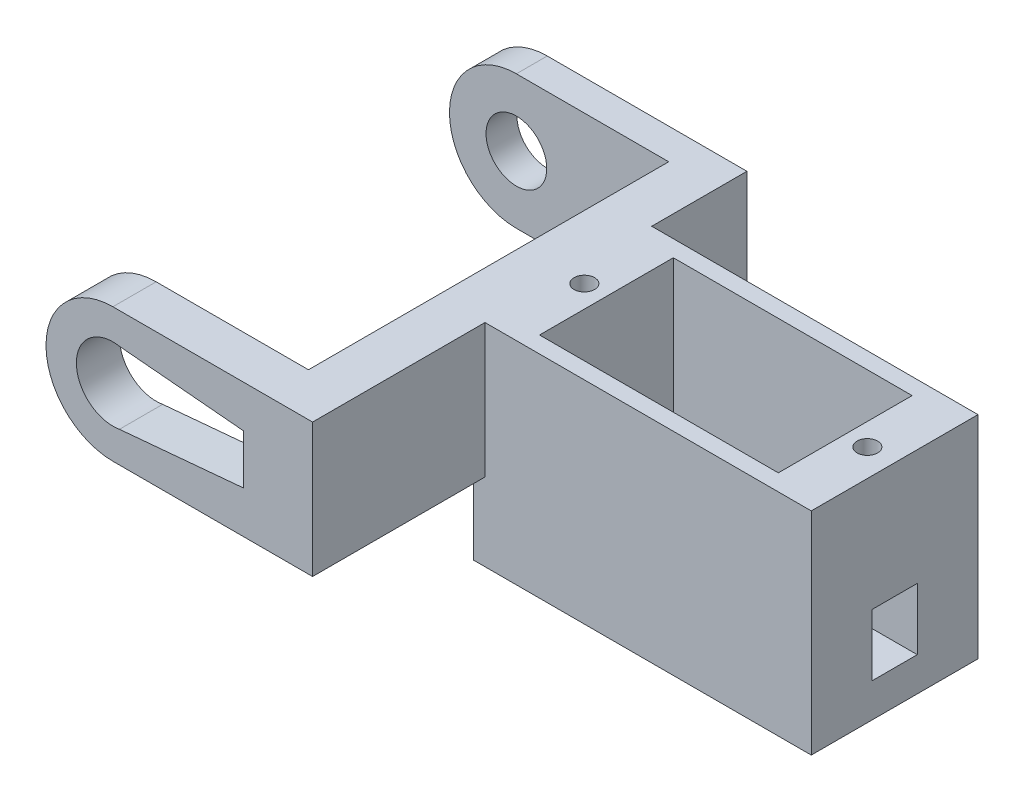
ISO-10303-21;
HEADER;
FILE_DESCRIPTION(('STEP AP214'),'2;1');
FILE_NAME('part.step','',(''),(''),'','','');
FILE_SCHEMA(('AUTOMOTIVE_DESIGN { 1 0 10303 214 1 1 1 1 }'));
ENDSEC;
DATA;
#1=APPLICATION_CONTEXT('core data for automotive mechanical design processes');
#2=APPLICATION_PROTOCOL_DEFINITION('international standard','automotive_design',2000,#1);
#3=PRODUCT_CONTEXT('',#1,'mechanical');
#4=PRODUCT('Part','Part','',(#3));
#5=PRODUCT_RELATED_PRODUCT_CATEGORY('part','',(#4));
#6=PRODUCT_DEFINITION_FORMATION('','',#4);
#7=PRODUCT_DEFINITION_CONTEXT('part definition',#1,'design');
#8=PRODUCT_DEFINITION('design','',#6,#7);
#9=PRODUCT_DEFINITION_SHAPE('','',#8);
#10=(LENGTH_UNIT() NAMED_UNIT(*) SI_UNIT(.MILLI.,.METRE.));
#11=(NAMED_UNIT(*) PLANE_ANGLE_UNIT() SI_UNIT($,.RADIAN.));
#12=(NAMED_UNIT(*) SI_UNIT($,.STERADIAN.) SOLID_ANGLE_UNIT());
#13=UNCERTAINTY_MEASURE_WITH_UNIT(LENGTH_MEASURE(1.E-05),#10,'distance_accuracy_value','');
#14=(GEOMETRIC_REPRESENTATION_CONTEXT(3) GLOBAL_UNCERTAINTY_ASSIGNED_CONTEXT((#13)) GLOBAL_UNIT_ASSIGNED_CONTEXT((#10,
#11,#12)) REPRESENTATION_CONTEXT('',''));
#15=CARTESIAN_POINT('',(0.,0.,0.));
#16=DIRECTION('',(0.,0.,1.));
#17=DIRECTION('',(1.,0.,0.));
#18=AXIS2_PLACEMENT_3D('',#15,#16,#17);
#19=CARTESIAN_POINT('',(-44.6,0.,0.));
#20=DIRECTION('',(-1.,0.,0.));
#21=DIRECTION('',(0.,0.,1.));
#22=AXIS2_PLACEMENT_3D('',#19,#20,#21);
#23=PLANE('',#22);
#24=DIRECTION('',(0.,0.,1.));
#25=VECTOR('',#24,1.);
#26=CARTESIAN_POINT('',(-44.6,71.,24.85));
#27=LINE('',#26,#25);
#28=CARTESIAN_POINT('',(-44.6,71.,-14.35));
#29=VERTEX_POINT('',#28);
#30=CARTESIAN_POINT('',(-44.6,71.,20.65));
#31=VERTEX_POINT('',#30);
#32=EDGE_CURVE('E370',#29,#31,#27,.T.);
#33=ORIENTED_EDGE('',*,*,#32,.F.);
#34=DIRECTION('',(0.,-1.,0.));
#35=VECTOR('',#34,1.);
#36=CARTESIAN_POINT('',(-44.6,0.,-14.35));
#37=LINE('',#36,#35);
#38=CARTESIAN_POINT('',(-44.6,58.,-14.35));
#39=VERTEX_POINT('',#38);
#40=EDGE_CURVE('E11',#29,#39,#37,.T.);
#41=ORIENTED_EDGE('',*,*,#40,.T.);
#42=DIRECTION('',(0.,0.,-1.));
#43=VECTOR('',#42,1.);
#44=CARTESIAN_POINT('',(-44.6,58.,24.85));
#45=LINE('',#44,#43);
#46=CARTESIAN_POINT('',(-44.6,58.,20.65));
#47=VERTEX_POINT('',#46);
#48=EDGE_CURVE('E364',#47,#39,#45,.T.);
#49=ORIENTED_EDGE('',*,*,#48,.F.);
#50=DIRECTION('',(0.,-1.,0.));
#51=VECTOR('',#50,1.);
#52=CARTESIAN_POINT('',(-44.6,0.,20.65));
#53=LINE('',#52,#51);
#54=EDGE_CURVE('E459',#31,#47,#53,.T.);
#55=ORIENTED_EDGE('',*,*,#54,.F.);
#56=EDGE_LOOP('',(#33,#41,#49,#55));
#57=FACE_BOUND('',#56,.T.);
#58=ADVANCED_FACE('F39',(#57),#23,.T.);
#59=CARTESIAN_POINT('',(-41.1,71.,8.1));
#60=DIRECTION('',(1.,0.,0.));
#61=DIRECTION('',(0.,0.,-1.));
#62=AXIS2_PLACEMENT_3D('',#59,#60,#61);
#63=PLANE('',#62);
#64=DIRECTION('',(0.,0.,1.));
#65=VECTOR('',#64,1.);
#66=CARTESIAN_POINT('',(-41.1,58.,8.1));
#67=LINE('',#66,#65);
#68=CARTESIAN_POINT('',(-41.1,58.,-8.1));
#69=VERTEX_POINT('',#68);
#70=CARTESIAN_POINT('',(-41.1,58.,8.1));
#71=VERTEX_POINT('',#70);
#72=EDGE_CURVE('E409',#69,#71,#67,.T.);
#73=ORIENTED_EDGE('',*,*,#72,.F.);
#74=DIRECTION('',(0.,-1.,0.));
#75=VECTOR('',#74,1.);
#76=CARTESIAN_POINT('',(-41.1,71.,-8.1));
#77=LINE('',#76,#75);
#78=CARTESIAN_POINT('',(-41.1,50.45,-8.1));
#79=VERTEX_POINT('',#78);
#80=EDGE_CURVE('E429',#69,#79,#77,.T.);
#81=ORIENTED_EDGE('',*,*,#80,.T.);
#82=DIRECTION('',(0.,0.,1.));
#83=VECTOR('',#82,1.);
#84=CARTESIAN_POINT('',(-41.1,50.45,8.1));
#85=LINE('',#84,#83);
#86=CARTESIAN_POINT('',(-41.1,50.45,8.1));
#87=VERTEX_POINT('',#86);
#88=EDGE_CURVE('E417',#79,#87,#85,.T.);
#89=ORIENTED_EDGE('',*,*,#88,.T.);
#90=DIRECTION('',(0.,-1.,0.));
#91=VECTOR('',#90,1.);
#92=CARTESIAN_POINT('',(-41.1,71.,8.1));
#93=LINE('',#92,#91);
#94=EDGE_CURVE('E452',#71,#87,#93,.T.);
#95=ORIENTED_EDGE('',*,*,#94,.F.);
#96=EDGE_LOOP('',(#73,#81,#89,#95));
#97=FACE_BOUND('',#96,.T.);
#98=ADVANCED_FACE('F41',(#97),#63,.F.);
#99=CARTESIAN_POINT('',(-41.1,71.,8.1));
#100=DIRECTION('',(0.,0.,-1.));
#101=DIRECTION('',(-1.,0.,0.));
#102=AXIS2_PLACEMENT_3D('',#99,#100,#101);
#103=PLANE('',#102);
#104=DIRECTION('',(1.,0.,0.));
#105=VECTOR('',#104,1.);
#106=CARTESIAN_POINT('',(-41.1,58.,8.1));
#107=LINE('',#106,#105);
#108=CARTESIAN_POINT('',(-40.,58.,8.1));
#109=VERTEX_POINT('',#108);
#110=EDGE_CURVE('E413',#71,#109,#107,.T.);
#111=ORIENTED_EDGE('',*,*,#110,.F.);
#112=ORIENTED_EDGE('',*,*,#94,.T.);
#113=DIRECTION('',(1.,0.,0.));
#114=VECTOR('',#113,1.);
#115=CARTESIAN_POINT('',(-41.1,50.45,8.1));
#116=LINE('',#115,#114);
#117=CARTESIAN_POINT('',(-8.3,50.45,8.1));
#118=VERTEX_POINT('',#117);
#119=EDGE_CURVE('E433',#87,#118,#116,.T.);
#120=ORIENTED_EDGE('',*,*,#119,.T.);
#121=DIRECTION('',(0.,-1.,0.));
#122=VECTOR('',#121,1.);
#123=CARTESIAN_POINT('',(-8.3,71.,8.1));
#124=LINE('',#123,#122);
#125=CARTESIAN_POINT('',(-8.3,71.,8.1));
#126=VERTEX_POINT('',#125);
#127=EDGE_CURVE('E448',#126,#118,#124,.T.);
#128=ORIENTED_EDGE('',*,*,#127,.F.);
#129=DIRECTION('',(1.,0.,0.));
#130=VECTOR('',#129,1.);
#131=CARTESIAN_POINT('',(-41.1,71.,8.1));
#132=LINE('',#131,#130);
#133=CARTESIAN_POINT('',(-40.,71.,8.1));
#134=VERTEX_POINT('',#133);
#135=EDGE_CURVE('E418',#134,#126,#132,.T.);
#136=ORIENTED_EDGE('',*,*,#135,.F.);
#137=DIRECTION('',(0.,1.,0.));
#138=VECTOR('',#137,1.);
#139=CARTESIAN_POINT('',(-40.,71.,8.1));
#140=LINE('',#139,#138);
#141=EDGE_CURVE('E405',#109,#134,#140,.T.);
#142=ORIENTED_EDGE('',*,*,#141,.F.);
#143=EDGE_LOOP('',(#111,#112,#120,#128,#136,#142));
#144=FACE_BOUND('',#143,.T.);
#145=ADVANCED_FACE('F508',(#144),#103,.F.);
#146=CARTESIAN_POINT('',(-41.1,71.,-8.1));
#147=DIRECTION('',(0.,0.,1.));
#148=DIRECTION('',(1.,0.,0.));
#149=AXIS2_PLACEMENT_3D('',#146,#147,#148);
#150=PLANE('',#149);
#151=DIRECTION('',(-1.,0.,0.));
#152=VECTOR('',#151,1.);
#153=CARTESIAN_POINT('',(-41.1,58.,-8.1));
#154=LINE('',#153,#152);
#155=CARTESIAN_POINT('',(-40.,58.,-8.1));
#156=VERTEX_POINT('',#155);
#157=EDGE_CURVE('E455',#156,#69,#154,.T.);
#158=ORIENTED_EDGE('',*,*,#157,.F.);
#159=DIRECTION('',(0.,-1.,0.));
#160=VECTOR('',#159,1.);
#161=CARTESIAN_POINT('',(-40.,71.,-8.1));
#162=LINE('',#161,#160);
#163=CARTESIAN_POINT('',(-40.,71.,-8.1));
#164=VERTEX_POINT('',#163);
#165=EDGE_CURVE('E401',#164,#156,#162,.T.);
#166=ORIENTED_EDGE('',*,*,#165,.F.);
#167=DIRECTION('',(-1.,0.,0.));
#168=VECTOR('',#167,1.);
#169=CARTESIAN_POINT('',(-41.1,71.,-8.1));
#170=LINE('',#169,#168);
#171=CARTESIAN_POINT('',(-8.3,71.,-8.1));
#172=VERTEX_POINT('',#171);
#173=EDGE_CURVE('E425',#172,#164,#170,.T.);
#174=ORIENTED_EDGE('',*,*,#173,.F.);
#175=DIRECTION('',(0.,-1.,0.));
#176=VECTOR('',#175,1.);
#177=CARTESIAN_POINT('',(-8.3,71.,-8.1));
#178=LINE('',#177,#176);
#179=CARTESIAN_POINT('',(-8.3,50.45,-8.1));
#180=VERTEX_POINT('',#179);
#181=EDGE_CURVE('E444',#172,#180,#178,.T.);
#182=ORIENTED_EDGE('',*,*,#181,.T.);
#183=DIRECTION('',(-1.,0.,0.));
#184=VECTOR('',#183,1.);
#185=CARTESIAN_POINT('',(-41.1,50.45,-8.1));
#186=LINE('',#185,#184);
#187=EDGE_CURVE('E422',#180,#79,#186,.T.);
#188=ORIENTED_EDGE('',*,*,#187,.T.);
#189=ORIENTED_EDGE('',*,*,#80,.F.);
#190=EDGE_LOOP('',(#158,#166,#174,#182,#188,#189));
#191=FACE_BOUND('',#190,.T.);
#192=ADVANCED_FACE('F535',(#191),#150,.F.);
#193=CARTESIAN_POINT('',(-8.3,71.,8.1));
#194=DIRECTION('',(-1.,0.,0.));
#195=DIRECTION('',(0.,0.,1.));
#196=AXIS2_PLACEMENT_3D('',#193,#194,#195);
#197=PLANE('',#196);
#198=DIRECTION('',(0.,0.,-1.));
#199=VECTOR('',#198,1.);
#200=CARTESIAN_POINT('',(-8.3,53.75,2.2));
#201=LINE('',#200,#199);
#202=CARTESIAN_POINT('',(-8.3,53.75,2.2));
#203=VERTEX_POINT('',#202);
#204=CARTESIAN_POINT('',(-8.3,53.75,-2.2));
#205=VERTEX_POINT('',#204);
#206=EDGE_CURVE('E659',#203,#205,#201,.T.);
#207=ORIENTED_EDGE('',*,*,#206,.F.);
#208=DIRECTION('',(0.,-1.,0.));
#209=VECTOR('',#208,1.);
#210=CARTESIAN_POINT('',(-8.3,53.75,2.2));
#211=LINE('',#210,#209);
#212=CARTESIAN_POINT('',(-8.3,59.75,2.2));
#213=VERTEX_POINT('',#212);
#214=EDGE_CURVE('E55',#213,#203,#211,.T.);
#215=ORIENTED_EDGE('',*,*,#214,.F.);
#216=DIRECTION('',(0.,0.,1.));
#217=VECTOR('',#216,1.);
#218=CARTESIAN_POINT('',(-8.3,59.75,2.2));
#219=LINE('',#218,#217);
#220=CARTESIAN_POINT('',(-8.3,59.75,-2.2));
#221=VERTEX_POINT('',#220);
#222=EDGE_CURVE('E231',#221,#213,#219,.T.);
#223=ORIENTED_EDGE('',*,*,#222,.F.);
#224=DIRECTION('',(0.,1.,0.));
#225=VECTOR('',#224,1.);
#226=CARTESIAN_POINT('',(-8.3,53.75,-2.2));
#227=LINE('',#226,#225);
#228=EDGE_CURVE('E657',#205,#221,#227,.T.);
#229=ORIENTED_EDGE('',*,*,#228,.F.);
#230=EDGE_LOOP('',(#207,#215,#223,#229));
#231=FACE_BOUND('',#230,.T.);
#232=DIRECTION('',(0.,0.,-1.));
#233=VECTOR('',#232,1.);
#234=CARTESIAN_POINT('',(-8.3,50.45,8.1));
#235=LINE('',#234,#233);
#236=EDGE_CURVE('E436',#118,#180,#235,.T.);
#237=ORIENTED_EDGE('',*,*,#236,.T.);
#238=ORIENTED_EDGE('',*,*,#181,.F.);
#239=DIRECTION('',(0.,0.,-1.));
#240=VECTOR('',#239,1.);
#241=CARTESIAN_POINT('',(-8.3,71.,8.1));
#242=LINE('',#241,#240);
#243=EDGE_CURVE('E421',#126,#172,#242,.T.);
#244=ORIENTED_EDGE('',*,*,#243,.F.);
#245=ORIENTED_EDGE('',*,*,#127,.T.);
#246=EDGE_LOOP('',(#237,#238,#244,#245));
#247=FACE_BOUND('',#246,.T.);
#248=ADVANCED_FACE('F530',(#231,#247),#197,.F.);
#249=CARTESIAN_POINT('',(0.,71.,0.));
#250=DIRECTION('',(0.,-1.,0.));
#251=DIRECTION('',(0.,0.,-1.));
#252=AXIS2_PLACEMENT_3D('',#249,#250,#251);
#253=PLANE('',#252);
#254=CARTESIAN_POINT('',(-10.95,71.,0.));
#255=DIRECTION('',(0.,1.,0.));
#256=DIRECTION('',(0.,0.,1.));
#257=AXIS2_PLACEMENT_3D('',#254,#255,#256);
#258=CIRCLE('',#257,0.999999999999999);
#259=CARTESIAN_POINT('',(-10.95,71.,0.999999999999999));
#260=VERTEX_POINT('',#259);
#261=EDGE_CURVE('E680',#260,#260,#258,.T.);
#262=ORIENTED_EDGE('',*,*,#261,.F.);
#263=EDGE_LOOP('',(#262));
#264=FACE_BOUND('',#263,.T.);
#265=CARTESIAN_POINT('',(-38.45,71.,0.));
#266=DIRECTION('',(0.,1.,0.));
#267=DIRECTION('',(0.,0.,1.));
#268=AXIS2_PLACEMENT_3D('',#265,#266,#267);
#269=CIRCLE('',#268,1.);
#270=CARTESIAN_POINT('',(-38.45,71.,1.));
#271=VERTEX_POINT('',#270);
#272=EDGE_CURVE('E688',#271,#271,#269,.T.);
#273=ORIENTED_EDGE('',*,*,#272,.F.);
#274=EDGE_LOOP('',(#273));
#275=FACE_BOUND('',#274,.T.);
#276=DIRECTION('',(1.,0.,0.));
#277=VECTOR('',#276,1.);
#278=CARTESIAN_POINT('',(-36.3,71.,6.5));
#279=LINE('',#278,#277);
#280=CARTESIAN_POINT('',(-36.3,71.,6.5));
#281=VERTEX_POINT('',#280);
#282=CARTESIAN_POINT('',(-13.1,71.,6.5));
#283=VERTEX_POINT('',#282);
#284=EDGE_CURVE('E252',#281,#283,#279,.T.);
#285=ORIENTED_EDGE('',*,*,#284,.F.);
#286=DIRECTION('',(0.,0.,1.));
#287=VECTOR('',#286,1.);
#288=CARTESIAN_POINT('',(-36.3,71.,6.5));
#289=LINE('',#288,#287);
#290=CARTESIAN_POINT('',(-36.3,71.,-6.5));
#291=VERTEX_POINT('',#290);
#292=EDGE_CURVE('E249',#291,#281,#289,.T.);
#293=ORIENTED_EDGE('',*,*,#292,.F.);
#294=DIRECTION('',(-1.,0.,0.));
#295=VECTOR('',#294,1.);
#296=CARTESIAN_POINT('',(-36.3,71.,-6.5));
#297=LINE('',#296,#295);
#298=CARTESIAN_POINT('',(-13.1,71.,-6.5));
#299=VERTEX_POINT('',#298);
#300=EDGE_CURVE('E261',#299,#291,#297,.T.);
#301=ORIENTED_EDGE('',*,*,#300,.F.);
#302=DIRECTION('',(0.,0.,-1.));
#303=VECTOR('',#302,1.);
#304=CARTESIAN_POINT('',(-13.1,71.,6.5));
#305=LINE('',#304,#303);
#306=EDGE_CURVE('E257',#283,#299,#305,.T.);
#307=ORIENTED_EDGE('',*,*,#306,.F.);
#308=EDGE_LOOP('',(#285,#293,#301,#307));
#309=FACE_BOUND('',#308,.T.);
#310=DIRECTION('',(-1.,0.,0.));
#311=VECTOR('',#310,1.);
#312=CARTESIAN_POINT('',(-40.,71.,-17.35));
#313=LINE('',#312,#311);
#314=CARTESIAN_POINT('',(-40.,71.,-17.35));
#315=VERTEX_POINT('',#314);
#316=CARTESIAN_POINT('',(-59.4,71.,-17.35));
#317=VERTEX_POINT('',#316);
#318=EDGE_CURVE('E391',#315,#317,#313,.T.);
#319=ORIENTED_EDGE('',*,*,#318,.T.);
#320=DIRECTION('',(0.,0.,-1.));
#321=VECTOR('',#320,1.);
#322=CARTESIAN_POINT('',(-59.4,71.,-14.35));
#323=LINE('',#322,#321);
#324=CARTESIAN_POINT('',(-59.4,71.,-14.35));
#325=VERTEX_POINT('',#324);
#326=EDGE_CURVE('E300',#325,#317,#323,.T.);
#327=ORIENTED_EDGE('',*,*,#326,.F.);
#328=DIRECTION('',(-1.,0.,0.));
#329=VECTOR('',#328,1.);
#330=CARTESIAN_POINT('',(-59.4,71.,-14.35));
#331=LINE('',#330,#329);
#332=EDGE_CURVE('E297',#29,#325,#331,.T.);
#333=ORIENTED_EDGE('',*,*,#332,.F.);
#334=ORIENTED_EDGE('',*,*,#32,.T.);
#335=DIRECTION('',(-1.,0.,0.));
#336=VECTOR('',#335,1.);
#337=CARTESIAN_POINT('',(-59.4,71.,20.65));
#338=LINE('',#337,#336);
#339=CARTESIAN_POINT('',(-59.4,71.,20.65));
#340=VERTEX_POINT('',#339);
#341=EDGE_CURVE('E354',#31,#340,#338,.T.);
#342=ORIENTED_EDGE('',*,*,#341,.T.);
#343=DIRECTION('',(0.,0.,-1.));
#344=VECTOR('',#343,1.);
#345=CARTESIAN_POINT('',(-59.4,71.,24.85));
#346=LINE('',#345,#344);
#347=CARTESIAN_POINT('',(-59.4,71.,24.85));
#348=VERTEX_POINT('',#347);
#349=EDGE_CURVE('E357',#348,#340,#346,.T.);
#350=ORIENTED_EDGE('',*,*,#349,.F.);
#351=DIRECTION('',(-1.,0.,0.));
#352=VECTOR('',#351,1.);
#353=CARTESIAN_POINT('',(-40.,71.,24.85));
#354=LINE('',#353,#352);
#355=CARTESIAN_POINT('',(-40.,71.,24.85));
#356=VERTEX_POINT('',#355);
#357=EDGE_CURVE('E383',#356,#348,#354,.T.);
#358=ORIENTED_EDGE('',*,*,#357,.F.);
#359=DIRECTION('',(0.,0.,1.));
#360=VECTOR('',#359,1.);
#361=CARTESIAN_POINT('',(-40.,71.,24.85));
#362=LINE('',#361,#360);
#363=EDGE_CURVE('E378',#134,#356,#362,.T.);
#364=ORIENTED_EDGE('',*,*,#363,.F.);
#365=ORIENTED_EDGE('',*,*,#135,.T.);
#366=ORIENTED_EDGE('',*,*,#243,.T.);
#367=ORIENTED_EDGE('',*,*,#173,.T.);
#368=EDGE_CURVE('E379',#315,#164,#362,.T.);
#369=ORIENTED_EDGE('',*,*,#368,.F.);
#370=EDGE_LOOP('',(#319,#327,#333,#334,#342,#350,#358,#364,#365,#366,#367,#369));
#371=FACE_BOUND('',#370,.T.);
#372=ADVANCED_FACE('F527',(#264,#275,#309,#371),#253,.F.);
#373=CARTESIAN_POINT('',(0.,50.45,0.));
#374=DIRECTION('',(0.,-1.,0.));
#375=DIRECTION('',(0.,0.,-1.));
#376=AXIS2_PLACEMENT_3D('',#373,#374,#375);
#377=PLANE('',#376);
#378=CARTESIAN_POINT('',(-19.2,50.45,0.));
#379=DIRECTION('',(0.,1.,0.));
#380=DIRECTION('',(0.,0.,1.));
#381=AXIS2_PLACEMENT_3D('',#378,#379,#380);
#382=CIRCLE('',#381,3.15);
#383=CARTESIAN_POINT('',(-19.2,50.45,3.15));
#384=VERTEX_POINT('',#383);
#385=EDGE_CURVE('E676',#384,#384,#382,.T.);
#386=ORIENTED_EDGE('',*,*,#385,.T.);
#387=EDGE_LOOP('',(#386));
#388=FACE_BOUND('',#387,.T.);
#389=ORIENTED_EDGE('',*,*,#88,.F.);
#390=ORIENTED_EDGE('',*,*,#187,.F.);
#391=ORIENTED_EDGE('',*,*,#236,.F.);
#392=ORIENTED_EDGE('',*,*,#119,.F.);
#393=EDGE_LOOP('',(#389,#390,#391,#392));
#394=FACE_BOUND('',#393,.T.);
#395=ADVANCED_FACE('F522',(#388,#394),#377,.T.);
#396=CARTESIAN_POINT('',(-40.,58.,24.85));
#397=DIRECTION('',(0.,1.,0.));
#398=DIRECTION('',(0.,0.,1.));
#399=AXIS2_PLACEMENT_3D('',#396,#397,#398);
#400=PLANE('',#399);
#401=DIRECTION('',(0.,0.,-1.));
#402=VECTOR('',#401,1.);
#403=CARTESIAN_POINT('',(-59.4,58.,-14.35));
#404=LINE('',#403,#402);
#405=CARTESIAN_POINT('',(-59.4,58.,-14.35));
#406=VERTEX_POINT('',#405);
#407=CARTESIAN_POINT('',(-59.4,58.,-17.35));
#408=VERTEX_POINT('',#407);
#409=EDGE_CURVE('E304',#406,#408,#404,.T.);
#410=ORIENTED_EDGE('',*,*,#409,.T.);
#411=DIRECTION('',(-1.,0.,0.));
#412=VECTOR('',#411,1.);
#413=CARTESIAN_POINT('',(-40.,58.,-17.35));
#414=LINE('',#413,#412);
#415=CARTESIAN_POINT('',(-40.,58.,-17.35));
#416=VERTEX_POINT('',#415);
#417=EDGE_CURVE('E394',#416,#408,#414,.T.);
#418=ORIENTED_EDGE('',*,*,#417,.F.);
#419=DIRECTION('',(0.,0.,-1.));
#420=VECTOR('',#419,1.);
#421=CARTESIAN_POINT('',(-40.,58.,24.85));
#422=LINE('',#421,#420);
#423=EDGE_CURVE('E369',#156,#416,#422,.T.);
#424=ORIENTED_EDGE('',*,*,#423,.F.);
#425=ORIENTED_EDGE('',*,*,#157,.T.);
#426=ORIENTED_EDGE('',*,*,#72,.T.);
#427=ORIENTED_EDGE('',*,*,#110,.T.);
#428=CARTESIAN_POINT('',(-40.,58.,24.85));
#429=VERTEX_POINT('',#428);
#430=EDGE_CURVE('E371',#429,#109,#422,.T.);
#431=ORIENTED_EDGE('',*,*,#430,.F.);
#432=DIRECTION('',(-1.,0.,0.));
#433=VECTOR('',#432,1.);
#434=CARTESIAN_POINT('',(-40.,58.,24.85));
#435=LINE('',#434,#433);
#436=CARTESIAN_POINT('',(-59.4,58.,24.85));
#437=VERTEX_POINT('',#436);
#438=EDGE_CURVE('E398',#429,#437,#435,.T.);
#439=ORIENTED_EDGE('',*,*,#438,.T.);
#440=DIRECTION('',(0.,0.,-1.));
#441=VECTOR('',#440,1.);
#442=CARTESIAN_POINT('',(-59.4,58.,24.85));
#443=LINE('',#442,#441);
#444=CARTESIAN_POINT('',(-59.4,58.,20.65));
#445=VERTEX_POINT('',#444);
#446=EDGE_CURVE('E361',#437,#445,#443,.T.);
#447=ORIENTED_EDGE('',*,*,#446,.T.);
#448=DIRECTION('',(1.,0.,0.));
#449=VECTOR('',#448,1.);
#450=CARTESIAN_POINT('',(-59.4,58.,20.65));
#451=LINE('',#450,#449);
#452=EDGE_CURVE('E347',#445,#47,#451,.T.);
#453=ORIENTED_EDGE('',*,*,#452,.T.);
#454=ORIENTED_EDGE('',*,*,#48,.T.);
#455=DIRECTION('',(1.,0.,0.));
#456=VECTOR('',#455,1.);
#457=CARTESIAN_POINT('',(-59.4,58.,-14.35));
#458=LINE('',#457,#456);
#459=EDGE_CURVE('E291',#406,#39,#458,.T.);
#460=ORIENTED_EDGE('',*,*,#459,.F.);
#461=EDGE_LOOP('',(#410,#418,#424,#425,#426,#427,#431,#439,#447,#453,#454,#460));
#462=FACE_BOUND('',#461,.T.);
#463=ADVANCED_FACE('F519',(#462),#400,.F.);
#464=CARTESIAN_POINT('',(-40.,0.,0.));
#465=DIRECTION('',(-1.,0.,0.));
#466=DIRECTION('',(0.,0.,1.));
#467=AXIS2_PLACEMENT_3D('',#464,#465,#466);
#468=PLANE('',#467);
#469=ORIENTED_EDGE('',*,*,#430,.T.);
#470=ORIENTED_EDGE('',*,*,#141,.T.);
#471=ORIENTED_EDGE('',*,*,#363,.T.);
#472=DIRECTION('',(0.,-1.,0.));
#473=VECTOR('',#472,1.);
#474=CARTESIAN_POINT('',(-40.,58.,24.85));
#475=LINE('',#474,#473);
#476=EDGE_CURVE('E365',#356,#429,#475,.T.);
#477=ORIENTED_EDGE('',*,*,#476,.T.);
#478=EDGE_LOOP('',(#469,#470,#471,#477));
#479=FACE_BOUND('',#478,.T.);
#480=ADVANCED_FACE('F513',(#479),#468,.F.);
#481=ORIENTED_EDGE('',*,*,#368,.T.);
#482=ORIENTED_EDGE('',*,*,#165,.T.);
#483=ORIENTED_EDGE('',*,*,#423,.T.);
#484=DIRECTION('',(0.,1.,0.));
#485=VECTOR('',#484,1.);
#486=CARTESIAN_POINT('',(-40.,58.,-17.35));
#487=LINE('',#486,#485);
#488=EDGE_CURVE('E375',#416,#315,#487,.T.);
#489=ORIENTED_EDGE('',*,*,#488,.T.);
#490=EDGE_LOOP('',(#481,#482,#483,#489));
#491=FACE_BOUND('',#490,.T.);
#492=ADVANCED_FACE('F526',(#491),#468,.F.);
#493=CARTESIAN_POINT('',(-40.,58.,24.85));
#494=DIRECTION('',(0.,0.,-1.));
#495=DIRECTION('',(-1.,0.,0.));
#496=AXIS2_PLACEMENT_3D('',#493,#494,#495);
#497=PLANE('',#496);
#498=CARTESIAN_POINT('',(-59.4,64.5,24.85));
#499=DIRECTION('',(0.,0.,1.));
#500=DIRECTION('',(1.,0.,0.));
#501=AXIS2_PLACEMENT_3D('',#498,#499,#500);
#502=CIRCLE('',#501,3.55);
#503=CARTESIAN_POINT('',(-58.7641054158039,67.9925832957554,24.85));
#504=VERTEX_POINT('',#503);
#505=CARTESIAN_POINT('',(-58.7641054158039,61.0074167042445,24.85));
#506=VERTEX_POINT('',#505);
#507=EDGE_CURVE('E333',#504,#506,#502,.T.);
#508=ORIENTED_EDGE('',*,*,#507,.F.);
#509=DIRECTION('',(-0.995948362239352,0.0899269689956986,0.));
#510=VECTOR('',#509,1.);
#511=CARTESIAN_POINT('',(-46.7,66.9032814053959,24.85));
#512=LINE('',#511,#510);
#513=CARTESIAN_POINT('',(-46.7,66.9032814053959,24.85));
#514=VERTEX_POINT('',#513);
#515=EDGE_CURVE('E313',#514,#504,#512,.T.);
#516=ORIENTED_EDGE('',*,*,#515,.F.);
#517=DIRECTION('',(0.,1.,0.));
#518=VECTOR('',#517,1.);
#519=CARTESIAN_POINT('',(-46.7,62.0967185946041,24.85));
#520=LINE('',#519,#518);
#521=CARTESIAN_POINT('',(-46.7,62.0967185946041,24.85));
#522=VERTEX_POINT('',#521);
#523=EDGE_CURVE('E324',#522,#514,#520,.T.);
#524=ORIENTED_EDGE('',*,*,#523,.F.);
#525=DIRECTION('',(0.995948362239352,0.089926968995698,0.));
#526=VECTOR('',#525,1.);
#527=CARTESIAN_POINT('',(-59.4,60.95,24.85));
#528=LINE('',#527,#526);
#529=EDGE_CURVE('E307',#506,#522,#528,.T.);
#530=ORIENTED_EDGE('',*,*,#529,.F.);
#531=EDGE_LOOP('',(#508,#516,#524,#530));
#532=FACE_BOUND('',#531,.T.);
#533=ORIENTED_EDGE('',*,*,#357,.T.);
#534=CARTESIAN_POINT('',(-59.4,64.5,24.85));
#535=DIRECTION('',(0.,0.,1.));
#536=DIRECTION('',(1.,0.,0.));
#537=AXIS2_PLACEMENT_3D('',#534,#535,#536);
#538=CIRCLE('',#537,6.5);
#539=EDGE_CURVE('E343',#348,#437,#538,.T.);
#540=ORIENTED_EDGE('',*,*,#539,.T.);
#541=ORIENTED_EDGE('',*,*,#438,.F.);
#542=ORIENTED_EDGE('',*,*,#476,.F.);
#543=EDGE_LOOP('',(#533,#540,#541,#542));
#544=FACE_BOUND('',#543,.T.);
#545=ADVANCED_FACE('F478',(#532,#544),#497,.F.);
#546=CARTESIAN_POINT('',(-40.,58.,-17.35));
#547=DIRECTION('',(0.,0.,1.));
#548=DIRECTION('',(1.,0.,0.));
#549=AXIS2_PLACEMENT_3D('',#546,#547,#548);
#550=PLANE('',#549);
#551=CARTESIAN_POINT('',(-59.4,64.5,-17.35));
#552=DIRECTION('',(0.,0.,1.));
#553=DIRECTION('',(1.,0.,0.));
#554=AXIS2_PLACEMENT_3D('',#551,#552,#553);
#555=CIRCLE('',#554,2.95);
#556=CARTESIAN_POINT('',(-56.45,64.5,-17.35));
#557=VERTEX_POINT('',#556);
#558=EDGE_CURVE('E279',#557,#557,#555,.T.);
#559=ORIENTED_EDGE('',*,*,#558,.T.);
#560=EDGE_LOOP('',(#559));
#561=FACE_BOUND('',#560,.T.);
#562=ORIENTED_EDGE('',*,*,#417,.T.);
#563=CARTESIAN_POINT('',(-59.4,64.5,-17.35));
#564=DIRECTION('',(0.,0.,1.));
#565=DIRECTION('',(1.,0.,0.));
#566=AXIS2_PLACEMENT_3D('',#563,#564,#565);
#567=CIRCLE('',#566,6.5);
#568=EDGE_CURVE('E283',#317,#408,#567,.T.);
#569=ORIENTED_EDGE('',*,*,#568,.F.);
#570=ORIENTED_EDGE('',*,*,#318,.F.);
#571=ORIENTED_EDGE('',*,*,#488,.F.);
#572=EDGE_LOOP('',(#562,#569,#570,#571));
#573=FACE_BOUND('',#572,.T.);
#574=ADVANCED_FACE('F515',(#561,#573),#550,.F.);
#575=CARTESIAN_POINT('',(0.,0.,20.65));
#576=DIRECTION('',(0.,0.,-1.));
#577=DIRECTION('',(-1.,0.,0.));
#578=AXIS2_PLACEMENT_3D('',#575,#576,#577);
#579=PLANE('',#578);
#580=DIRECTION('',(-0.995948362239352,0.0899269689956986,0.));
#581=VECTOR('',#580,1.);
#582=CARTESIAN_POINT('',(-46.7,66.9032814053959,20.65));
#583=LINE('',#582,#581);
#584=CARTESIAN_POINT('',(-46.7,66.9032814053959,20.65));
#585=VERTEX_POINT('',#584);
#586=CARTESIAN_POINT('',(-58.7641054158039,67.9925832957554,20.65));
#587=VERTEX_POINT('',#586);
#588=EDGE_CURVE('E317',#585,#587,#583,.T.);
#589=ORIENTED_EDGE('',*,*,#588,.T.);
#590=CARTESIAN_POINT('',(-59.4,64.5,20.65));
#591=DIRECTION('',(0.,0.,1.));
#592=DIRECTION('',(1.,0.,0.));
#593=AXIS2_PLACEMENT_3D('',#590,#591,#592);
#594=CIRCLE('',#593,3.55);
#595=CARTESIAN_POINT('',(-58.7641054158039,61.0074167042446,20.65));
#596=VERTEX_POINT('',#595);
#597=EDGE_CURVE('E337',#587,#596,#594,.T.);
#598=ORIENTED_EDGE('',*,*,#597,.T.);
#599=DIRECTION('',(0.995948362239352,0.089926968995698,0.));
#600=VECTOR('',#599,1.);
#601=CARTESIAN_POINT('',(-59.4,60.95,20.65));
#602=LINE('',#601,#600);
#603=CARTESIAN_POINT('',(-46.7,62.0967185946041,20.65));
#604=VERTEX_POINT('',#603);
#605=EDGE_CURVE('E308',#596,#604,#602,.T.);
#606=ORIENTED_EDGE('',*,*,#605,.T.);
#607=DIRECTION('',(0.,1.,0.));
#608=VECTOR('',#607,1.);
#609=CARTESIAN_POINT('',(-46.7,62.0967185946041,20.65));
#610=LINE('',#609,#608);
#611=EDGE_CURVE('E312',#604,#585,#610,.T.);
#612=ORIENTED_EDGE('',*,*,#611,.T.);
#613=EDGE_LOOP('',(#589,#598,#606,#612));
#614=FACE_BOUND('',#613,.T.);
#615=ORIENTED_EDGE('',*,*,#452,.F.);
#616=CARTESIAN_POINT('',(-59.4,64.5,20.65));
#617=DIRECTION('',(0.,0.,1.));
#618=DIRECTION('',(1.,0.,0.));
#619=AXIS2_PLACEMENT_3D('',#616,#617,#618);
#620=CIRCLE('',#619,6.5);
#621=EDGE_CURVE('E340',#340,#445,#620,.T.);
#622=ORIENTED_EDGE('',*,*,#621,.F.);
#623=ORIENTED_EDGE('',*,*,#341,.F.);
#624=ORIENTED_EDGE('',*,*,#54,.T.);
#625=EDGE_LOOP('',(#615,#622,#623,#624));
#626=FACE_BOUND('',#625,.T.);
#627=ADVANCED_FACE('F488',(#614,#626),#579,.T.);
#628=CARTESIAN_POINT('',(-59.4,64.5,24.85));
#629=DIRECTION('',(0.,0.,-1.));
#630=DIRECTION('',(-1.,0.,0.));
#631=AXIS2_PLACEMENT_3D('',#628,#629,#630);
#632=CYLINDRICAL_SURFACE('',#631,6.5);
#633=ORIENTED_EDGE('',*,*,#621,.T.);
#634=ORIENTED_EDGE('',*,*,#446,.F.);
#635=ORIENTED_EDGE('',*,*,#539,.F.);
#636=ORIENTED_EDGE('',*,*,#349,.T.);
#637=EDGE_LOOP('',(#633,#634,#635,#636));
#638=FACE_BOUND('',#637,.T.);
#639=ADVANCED_FACE('F498',(#638),#632,.T.);
#640=CARTESIAN_POINT('',(-59.4,64.5,20.65));
#641=DIRECTION('',(0.,0.,1.));
#642=DIRECTION('',(1.,0.,0.));
#643=AXIS2_PLACEMENT_3D('',#640,#641,#642);
#644=CYLINDRICAL_SURFACE('',#643,3.55);
#645=ORIENTED_EDGE('',*,*,#507,.T.);
#646=DIRECTION('',(0.,0.,1.));
#647=VECTOR('',#646,1.);
#648=CARTESIAN_POINT('',(-58.7641054158038,61.0074167042446,20.65));
#649=LINE('',#648,#647);
#650=EDGE_CURVE('E463',#506,#596,#649,.F.);
#651=ORIENTED_EDGE('',*,*,#650,.T.);
#652=ORIENTED_EDGE('',*,*,#597,.F.);
#653=DIRECTION('',(0.,0.,1.));
#654=VECTOR('',#653,1.);
#655=CARTESIAN_POINT('',(-58.7641054158038,67.9925832957554,20.65));
#656=LINE('',#655,#654);
#657=EDGE_CURVE('E48',#587,#504,#656,.T.);
#658=ORIENTED_EDGE('',*,*,#657,.T.);
#659=EDGE_LOOP('',(#645,#651,#652,#658));
#660=FACE_BOUND('',#659,.T.);
#661=ADVANCED_FACE('F471',(#660),#644,.F.);
#662=CARTESIAN_POINT('',(-46.7,66.9032814053959,20.65));
#663=DIRECTION('',(0.0899269689956985,0.995948362239352,0.));
#664=DIRECTION('',(-0.995948362239352,0.0899269689956985,0.));
#665=AXIS2_PLACEMENT_3D('',#662,#663,#664);
#666=PLANE('',#665);
#667=ORIENTED_EDGE('',*,*,#588,.F.);
#668=DIRECTION('',(0.,0.,1.));
#669=VECTOR('',#668,1.);
#670=CARTESIAN_POINT('',(-46.7,66.9032814053959,20.65));
#671=LINE('',#670,#669);
#672=EDGE_CURVE('E330',#585,#514,#671,.T.);
#673=ORIENTED_EDGE('',*,*,#672,.T.);
#674=ORIENTED_EDGE('',*,*,#515,.T.);
#675=ORIENTED_EDGE('',*,*,#657,.F.);
#676=EDGE_LOOP('',(#667,#673,#674,#675));
#677=FACE_BOUND('',#676,.T.);
#678=ADVANCED_FACE('F490',(#677),#666,.F.);
#679=CARTESIAN_POINT('',(-59.4,60.95,20.65));
#680=DIRECTION('',(0.089926968995698,-0.995948362239352,0.));
#681=DIRECTION('',(0.995948362239352,0.089926968995698,0.));
#682=AXIS2_PLACEMENT_3D('',#679,#680,#681);
#683=PLANE('',#682);
#684=ORIENTED_EDGE('',*,*,#529,.T.);
#685=DIRECTION('',(0.,0.,1.));
#686=VECTOR('',#685,1.);
#687=CARTESIAN_POINT('',(-46.7,62.0967185946041,20.65));
#688=LINE('',#687,#686);
#689=EDGE_CURVE('E321',#604,#522,#688,.T.);
#690=ORIENTED_EDGE('',*,*,#689,.F.);
#691=ORIENTED_EDGE('',*,*,#605,.F.);
#692=ORIENTED_EDGE('',*,*,#650,.F.);
#693=EDGE_LOOP('',(#684,#690,#691,#692));
#694=FACE_BOUND('',#693,.T.);
#695=ADVANCED_FACE('F482',(#694),#683,.F.);
#696=CARTESIAN_POINT('',(-46.7,62.0967185946041,20.65));
#697=DIRECTION('',(1.,0.,0.));
#698=DIRECTION('',(0.,0.,-1.));
#699=AXIS2_PLACEMENT_3D('',#696,#697,#698);
#700=PLANE('',#699);
#701=ORIENTED_EDGE('',*,*,#523,.T.);
#702=ORIENTED_EDGE('',*,*,#672,.F.);
#703=ORIENTED_EDGE('',*,*,#611,.F.);
#704=ORIENTED_EDGE('',*,*,#689,.T.);
#705=EDGE_LOOP('',(#701,#702,#703,#704));
#706=FACE_BOUND('',#705,.T.);
#707=ADVANCED_FACE('F486',(#706),#700,.F.);
#708=CARTESIAN_POINT('',(0.,0.,-14.35));
#709=DIRECTION('',(0.,0.,-1.));
#710=DIRECTION('',(-1.,0.,0.));
#711=AXIS2_PLACEMENT_3D('',#708,#709,#710);
#712=PLANE('',#711);
#713=CARTESIAN_POINT('',(-59.4,64.5,-14.35));
#714=DIRECTION('',(0.,0.,1.));
#715=DIRECTION('',(1.,0.,0.));
#716=AXIS2_PLACEMENT_3D('',#713,#714,#715);
#717=CIRCLE('',#716,2.95);
#718=CARTESIAN_POINT('',(-56.45,64.5,-14.35));
#719=VERTEX_POINT('',#718);
#720=EDGE_CURVE('E269',#719,#719,#717,.T.);
#721=ORIENTED_EDGE('',*,*,#720,.F.);
#722=EDGE_LOOP('',(#721));
#723=FACE_BOUND('',#722,.T.);
#724=ORIENTED_EDGE('',*,*,#332,.T.);
#725=CARTESIAN_POINT('',(-59.4,64.5,-14.35));
#726=DIRECTION('',(0.,0.,1.));
#727=DIRECTION('',(1.,0.,0.));
#728=AXIS2_PLACEMENT_3D('',#725,#726,#727);
#729=CIRCLE('',#728,6.5);
#730=EDGE_CURVE('E287',#325,#406,#729,.T.);
#731=ORIENTED_EDGE('',*,*,#730,.T.);
#732=ORIENTED_EDGE('',*,*,#459,.T.);
#733=ORIENTED_EDGE('',*,*,#40,.F.);
#734=EDGE_LOOP('',(#724,#731,#732,#733));
#735=FACE_BOUND('',#734,.T.);
#736=ADVANCED_FACE('F583',(#723,#735),#712,.F.);
#737=CARTESIAN_POINT('',(-59.4,64.5,-14.35));
#738=DIRECTION('',(0.,0.,-1.));
#739=DIRECTION('',(-1.,0.,0.));
#740=AXIS2_PLACEMENT_3D('',#737,#738,#739);
#741=CYLINDRICAL_SURFACE('',#740,6.5);
#742=ORIENTED_EDGE('',*,*,#568,.T.);
#743=ORIENTED_EDGE('',*,*,#409,.F.);
#744=ORIENTED_EDGE('',*,*,#730,.F.);
#745=ORIENTED_EDGE('',*,*,#326,.T.);
#746=EDGE_LOOP('',(#742,#743,#744,#745));
#747=FACE_BOUND('',#746,.T.);
#748=ADVANCED_FACE('F587',(#747),#741,.T.);
#749=CARTESIAN_POINT('',(-59.4,64.5,-17.35));
#750=DIRECTION('',(0.,0.,1.));
#751=DIRECTION('',(1.,0.,0.));
#752=AXIS2_PLACEMENT_3D('',#749,#750,#751);
#753=CYLINDRICAL_SURFACE('',#752,2.95);
#754=ORIENTED_EDGE('',*,*,#558,.F.);
#755=EDGE_LOOP('',(#754));
#756=FACE_BOUND('',#755,.T.);
#757=ORIENTED_EDGE('',*,*,#720,.T.);
#758=EDGE_LOOP('',(#757));
#759=FACE_BOUND('',#758,.T.);
#760=ADVANCED_FACE('F590',(#756,#759),#753,.F.);
#761=CARTESIAN_POINT('',(-36.3,53.75,6.5));
#762=DIRECTION('',(-1.,0.,0.));
#763=DIRECTION('',(0.,0.,1.));
#764=AXIS2_PLACEMENT_3D('',#761,#762,#763);
#765=PLANE('',#764);
#766=ORIENTED_EDGE('',*,*,#292,.T.);
#767=DIRECTION('',(0.,1.,0.));
#768=VECTOR('',#767,1.);
#769=CARTESIAN_POINT('',(-36.3,53.75,6.5));
#770=LINE('',#769,#768);
#771=CARTESIAN_POINT('',(-36.3,53.75,6.5));
#772=VERTEX_POINT('',#771);
#773=EDGE_CURVE('E244',#772,#281,#770,.T.);
#774=ORIENTED_EDGE('',*,*,#773,.F.);
#775=DIRECTION('',(0.,0.,1.));
#776=VECTOR('',#775,1.);
#777=CARTESIAN_POINT('',(-36.3,53.75,6.5));
#778=LINE('',#777,#776);
#779=CARTESIAN_POINT('',(-36.3,53.75,-6.5));
#780=VERTEX_POINT('',#779);
#781=EDGE_CURVE('E265',#780,#772,#778,.T.);
#782=ORIENTED_EDGE('',*,*,#781,.F.);
#783=DIRECTION('',(0.,1.,0.));
#784=VECTOR('',#783,1.);
#785=CARTESIAN_POINT('',(-36.3,53.75,-6.5));
#786=LINE('',#785,#784);
#787=EDGE_CURVE('E266',#780,#291,#786,.T.);
#788=ORIENTED_EDGE('',*,*,#787,.T.);
#789=EDGE_LOOP('',(#766,#774,#782,#788));
#790=FACE_BOUND('',#789,.T.);
#791=ADVANCED_FACE('F596',(#790),#765,.F.);
#792=CARTESIAN_POINT('',(-36.3,53.75,-6.5));
#793=DIRECTION('',(0.,0.,-1.));
#794=DIRECTION('',(-1.,0.,0.));
#795=AXIS2_PLACEMENT_3D('',#792,#793,#794);
#796=PLANE('',#795);
#797=ORIENTED_EDGE('',*,*,#300,.T.);
#798=ORIENTED_EDGE('',*,*,#787,.F.);
#799=DIRECTION('',(-1.,0.,0.));
#800=VECTOR('',#799,1.);
#801=CARTESIAN_POINT('',(-36.3,53.75,-6.5));
#802=LINE('',#801,#800);
#803=CARTESIAN_POINT('',(-13.1,53.75,-6.5));
#804=VERTEX_POINT('',#803);
#805=EDGE_CURVE('E238',#804,#780,#802,.T.);
#806=ORIENTED_EDGE('',*,*,#805,.F.);
#807=DIRECTION('',(0.,1.,0.));
#808=VECTOR('',#807,1.);
#809=CARTESIAN_POINT('',(-13.1,53.75,-6.5));
#810=LINE('',#809,#808);
#811=EDGE_CURVE('E270',#804,#299,#810,.T.);
#812=ORIENTED_EDGE('',*,*,#811,.T.);
#813=EDGE_LOOP('',(#797,#798,#806,#812));
#814=FACE_BOUND('',#813,.T.);
#815=ADVANCED_FACE('F603',(#814),#796,.F.);
#816=CARTESIAN_POINT('',(-13.1,53.75,6.5));
#817=DIRECTION('',(1.,0.,0.));
#818=DIRECTION('',(0.,0.,-1.));
#819=AXIS2_PLACEMENT_3D('',#816,#817,#818);
#820=PLANE('',#819);
#821=DIRECTION('',(0.,0.,1.));
#822=VECTOR('',#821,1.);
#823=CARTESIAN_POINT('',(-13.1,59.75,2.2));
#824=LINE('',#823,#822);
#825=CARTESIAN_POINT('',(-13.1,59.75,-2.2));
#826=VERTEX_POINT('',#825);
#827=CARTESIAN_POINT('',(-13.1,59.75,2.2));
#828=VERTEX_POINT('',#827);
#829=EDGE_CURVE('E222',#826,#828,#824,.T.);
#830=ORIENTED_EDGE('',*,*,#829,.T.);
#831=DIRECTION('',(0.,-1.,0.));
#832=VECTOR('',#831,1.);
#833=CARTESIAN_POINT('',(-13.1,53.75,2.2));
#834=LINE('',#833,#832);
#835=CARTESIAN_POINT('',(-13.1,53.75,2.2));
#836=VERTEX_POINT('',#835);
#837=EDGE_CURVE('E214',#828,#836,#834,.T.);
#838=ORIENTED_EDGE('',*,*,#837,.T.);
#839=DIRECTION('',(0.,0.,-1.));
#840=VECTOR('',#839,1.);
#841=CARTESIAN_POINT('',(-13.1,53.75,6.5));
#842=LINE('',#841,#840);
#843=CARTESIAN_POINT('',(-13.1,53.75,6.5));
#844=VERTEX_POINT('',#843);
#845=EDGE_CURVE('E227',#844,#836,#842,.T.);
#846=ORIENTED_EDGE('',*,*,#845,.F.);
#847=DIRECTION('',(0.,1.,0.));
#848=VECTOR('',#847,1.);
#849=CARTESIAN_POINT('',(-13.1,53.75,6.5));
#850=LINE('',#849,#848);
#851=EDGE_CURVE('E273',#844,#283,#850,.T.);
#852=ORIENTED_EDGE('',*,*,#851,.T.);
#853=ORIENTED_EDGE('',*,*,#306,.T.);
#854=ORIENTED_EDGE('',*,*,#811,.F.);
#855=CARTESIAN_POINT('',(-13.1,53.75,-2.2));
#856=VERTEX_POINT('',#855);
#857=EDGE_CURVE('E239',#856,#804,#842,.T.);
#858=ORIENTED_EDGE('',*,*,#857,.F.);
#859=DIRECTION('',(0.,1.,0.));
#860=VECTOR('',#859,1.);
#861=CARTESIAN_POINT('',(-13.1,53.75,-2.2));
#862=LINE('',#861,#860);
#863=EDGE_CURVE('E63',#856,#826,#862,.T.);
#864=ORIENTED_EDGE('',*,*,#863,.T.);
#865=EDGE_LOOP('',(#830,#838,#846,#852,#853,#854,#858,#864));
#866=FACE_BOUND('',#865,.T.);
#867=ADVANCED_FACE('F226',(#866),#820,.F.);
#868=CARTESIAN_POINT('',(-36.3,53.75,6.5));
#869=DIRECTION('',(0.,0.,1.));
#870=DIRECTION('',(1.,0.,0.));
#871=AXIS2_PLACEMENT_3D('',#868,#869,#870);
#872=PLANE('',#871);
#873=ORIENTED_EDGE('',*,*,#284,.T.);
#874=ORIENTED_EDGE('',*,*,#851,.F.);
#875=DIRECTION('',(1.,0.,0.));
#876=VECTOR('',#875,1.);
#877=CARTESIAN_POINT('',(-36.3,53.75,6.5));
#878=LINE('',#877,#876);
#879=EDGE_CURVE('E236',#772,#844,#878,.T.);
#880=ORIENTED_EDGE('',*,*,#879,.F.);
#881=ORIENTED_EDGE('',*,*,#773,.T.);
#882=EDGE_LOOP('',(#873,#874,#880,#881));
#883=FACE_BOUND('',#882,.T.);
#884=ADVANCED_FACE('F605',(#883),#872,.F.);
#885=CARTESIAN_POINT('',(0.,53.75,0.));
#886=DIRECTION('',(0.,-1.,0.));
#887=DIRECTION('',(0.,0.,-1.));
#888=AXIS2_PLACEMENT_3D('',#885,#886,#887);
#889=PLANE('',#888);
#890=ORIENTED_EDGE('',*,*,#781,.T.);
#891=ORIENTED_EDGE('',*,*,#879,.T.);
#892=ORIENTED_EDGE('',*,*,#845,.T.);
#893=DIRECTION('',(1.,0.,0.));
#894=VECTOR('',#893,1.);
#895=CARTESIAN_POINT('',(-13.1,53.75,2.2));
#896=LINE('',#895,#894);
#897=EDGE_CURVE('E211',#836,#203,#896,.T.);
#898=ORIENTED_EDGE('',*,*,#897,.T.);
#899=ORIENTED_EDGE('',*,*,#206,.T.);
#900=DIRECTION('',(1.,0.,0.));
#901=VECTOR('',#900,1.);
#902=CARTESIAN_POINT('',(-13.1,53.75,-2.2));
#903=LINE('',#902,#901);
#904=EDGE_CURVE('E221',#856,#205,#903,.T.);
#905=ORIENTED_EDGE('',*,*,#904,.F.);
#906=ORIENTED_EDGE('',*,*,#857,.T.);
#907=ORIENTED_EDGE('',*,*,#805,.T.);
#908=EDGE_LOOP('',(#890,#891,#892,#898,#899,#905,#906,#907));
#909=FACE_BOUND('',#908,.T.);
#910=ADVANCED_FACE('F234',(#909),#889,.F.);
#911=CARTESIAN_POINT('',(-38.45,65.,0.));
#912=DIRECTION('',(0.,1.,0.));
#913=DIRECTION('',(0.,0.,1.));
#914=AXIS2_PLACEMENT_3D('',#911,#912,#913);
#915=CYLINDRICAL_SURFACE('',#914,1.);
#916=CARTESIAN_POINT('',(-38.45,65.,0.));
#917=DIRECTION('',(0.,1.,0.));
#918=DIRECTION('',(0.,0.,1.));
#919=AXIS2_PLACEMENT_3D('',#916,#917,#918);
#920=CIRCLE('',#919,1.);
#921=CARTESIAN_POINT('',(-38.45,65.,1.));
#922=VERTEX_POINT('',#921);
#923=EDGE_CURVE('E253',#922,#922,#920,.T.);
#924=ORIENTED_EDGE('',*,*,#923,.F.);
#925=EDGE_LOOP('',(#924));
#926=FACE_BOUND('',#925,.T.);
#927=ORIENTED_EDGE('',*,*,#272,.T.);
#928=EDGE_LOOP('',(#927));
#929=FACE_BOUND('',#928,.T.);
#930=ADVANCED_FACE('F616',(#926,#929),#915,.F.);
#931=CARTESIAN_POINT('',(-38.45,65.,0.));
#932=DIRECTION('',(0.,1.,0.));
#933=DIRECTION('',(0.,0.,1.));
#934=AXIS2_PLACEMENT_3D('',#931,#932,#933);
#935=PLANE('',#934);
#936=ORIENTED_EDGE('',*,*,#923,.T.);
#937=EDGE_LOOP('',(#936));
#938=FACE_BOUND('',#937,.T.);
#939=ADVANCED_FACE('F619',(#938),#935,.T.);
#940=CARTESIAN_POINT('',(-10.95,65.,0.));
#941=DIRECTION('',(0.,1.,0.));
#942=DIRECTION('',(0.,0.,1.));
#943=AXIS2_PLACEMENT_3D('',#940,#941,#942);
#944=CYLINDRICAL_SURFACE('',#943,0.999999999999999);
#945=CARTESIAN_POINT('',(-10.95,65.,0.));
#946=DIRECTION('',(0.,1.,0.));
#947=DIRECTION('',(0.,0.,1.));
#948=AXIS2_PLACEMENT_3D('',#945,#946,#947);
#949=CIRCLE('',#948,0.999999999999999);
#950=CARTESIAN_POINT('',(-10.95,65.,0.999999999999999));
#951=VERTEX_POINT('',#950);
#952=EDGE_CURVE('E684',#951,#951,#949,.T.);
#953=ORIENTED_EDGE('',*,*,#952,.F.);
#954=EDGE_LOOP('',(#953));
#955=FACE_BOUND('',#954,.T.);
#956=ORIENTED_EDGE('',*,*,#261,.T.);
#957=EDGE_LOOP('',(#956));
#958=FACE_BOUND('',#957,.T.);
#959=ADVANCED_FACE('F623',(#955,#958),#944,.F.);
#960=CARTESIAN_POINT('',(-10.95,65.,0.));
#961=DIRECTION('',(0.,1.,0.));
#962=DIRECTION('',(0.,0.,1.));
#963=AXIS2_PLACEMENT_3D('',#960,#961,#962);
#964=PLANE('',#963);
#965=ORIENTED_EDGE('',*,*,#952,.T.);
#966=EDGE_LOOP('',(#965));
#967=FACE_BOUND('',#966,.T.);
#968=ADVANCED_FACE('F627',(#967),#964,.T.);
#969=CARTESIAN_POINT('',(-19.2,50.45,0.));
#970=DIRECTION('',(0.,1.,0.));
#971=DIRECTION('',(0.,0.,1.));
#972=AXIS2_PLACEMENT_3D('',#969,#970,#971);
#973=CYLINDRICAL_SURFACE('',#972,3.15);
#974=ORIENTED_EDGE('',*,*,#385,.F.);
#975=EDGE_LOOP('',(#974));
#976=FACE_BOUND('',#975,.T.);
#977=CARTESIAN_POINT('',(-19.2,53.05,0.));
#978=DIRECTION('',(0.,1.,0.));
#979=DIRECTION('',(0.,0.,1.));
#980=AXIS2_PLACEMENT_3D('',#977,#978,#979);
#981=CIRCLE('',#980,3.15);
#982=CARTESIAN_POINT('',(-19.2,53.05,3.15));
#983=VERTEX_POINT('',#982);
#984=EDGE_CURVE('E671',#983,#983,#981,.T.);
#985=ORIENTED_EDGE('',*,*,#984,.T.);
#986=EDGE_LOOP('',(#985));
#987=FACE_BOUND('',#986,.T.);
#988=ADVANCED_FACE('F631',(#976,#987),#973,.F.);
#989=CARTESIAN_POINT('',(-19.2,53.05,0.));
#990=DIRECTION('',(0.,1.,0.));
#991=DIRECTION('',(0.,0.,1.));
#992=AXIS2_PLACEMENT_3D('',#989,#990,#991);
#993=PLANE('',#992);
#994=ORIENTED_EDGE('',*,*,#984,.F.);
#995=EDGE_LOOP('',(#994));
#996=FACE_BOUND('',#995,.T.);
#997=ADVANCED_FACE('F635',(#996),#993,.F.);
#998=CARTESIAN_POINT('',(-13.1,53.75,2.2));
#999=DIRECTION('',(0.,0.,1.));
#1000=DIRECTION('',(1.,0.,0.));
#1001=AXIS2_PLACEMENT_3D('',#998,#999,#1000);
#1002=PLANE('',#1001);
#1003=ORIENTED_EDGE('',*,*,#214,.T.);
#1004=ORIENTED_EDGE('',*,*,#897,.F.);
#1005=ORIENTED_EDGE('',*,*,#837,.F.);
#1006=DIRECTION('',(1.,0.,0.));
#1007=VECTOR('',#1006,1.);
#1008=CARTESIAN_POINT('',(-13.1,59.75,2.2));
#1009=LINE('',#1008,#1007);
#1010=EDGE_CURVE('E652',#828,#213,#1009,.T.);
#1011=ORIENTED_EDGE('',*,*,#1010,.T.);
#1012=EDGE_LOOP('',(#1003,#1004,#1005,#1011));
#1013=FACE_BOUND('',#1012,.T.);
#1014=ADVANCED_FACE('F213',(#1013),#1002,.F.);
#1015=CARTESIAN_POINT('',(-13.1,59.75,2.2));
#1016=DIRECTION('',(0.,1.,0.));
#1017=DIRECTION('',(0.,0.,1.));
#1018=AXIS2_PLACEMENT_3D('',#1015,#1016,#1017);
#1019=PLANE('',#1018);
#1020=ORIENTED_EDGE('',*,*,#222,.T.);
#1021=ORIENTED_EDGE('',*,*,#1010,.F.);
#1022=ORIENTED_EDGE('',*,*,#829,.F.);
#1023=DIRECTION('',(1.,0.,0.));
#1024=VECTOR('',#1023,1.);
#1025=CARTESIAN_POINT('',(-13.1,59.75,-2.2));
#1026=LINE('',#1025,#1024);
#1027=EDGE_CURVE('E653',#826,#221,#1026,.T.);
#1028=ORIENTED_EDGE('',*,*,#1027,.T.);
#1029=EDGE_LOOP('',(#1020,#1021,#1022,#1028));
#1030=FACE_BOUND('',#1029,.T.);
#1031=ADVANCED_FACE('F642',(#1030),#1019,.F.);
#1032=CARTESIAN_POINT('',(-13.1,53.75,-2.2));
#1033=DIRECTION('',(0.,0.,-1.));
#1034=DIRECTION('',(-1.,0.,0.));
#1035=AXIS2_PLACEMENT_3D('',#1032,#1033,#1034);
#1036=PLANE('',#1035);
#1037=ORIENTED_EDGE('',*,*,#228,.T.);
#1038=ORIENTED_EDGE('',*,*,#1027,.F.);
#1039=ORIENTED_EDGE('',*,*,#863,.F.);
#1040=ORIENTED_EDGE('',*,*,#904,.T.);
#1041=EDGE_LOOP('',(#1037,#1038,#1039,#1040));
#1042=FACE_BOUND('',#1041,.T.);
#1043=ADVANCED_FACE('F643',(#1042),#1036,.F.);
#1044=CLOSED_SHELL('',(#58,#98,#145,#192,#248,#372,#395,#463,#480,#492,#545,#574,#627,#639,#661,
#678,#695,#707,#736,#748,#760,#791,#815,#867,#884,#910,#930,#939,#959,#968,#988,#997,#1014,
#1031,#1043));
#1045=MANIFOLD_SOLID_BREP('B2',#1044);
#1046=ADVANCED_BREP_SHAPE_REPRESENTATION('',(#18,#1045),#14);
#1047=SHAPE_DEFINITION_REPRESENTATION(#9,#1046);
ENDSEC;
END-ISO-10303-21;
